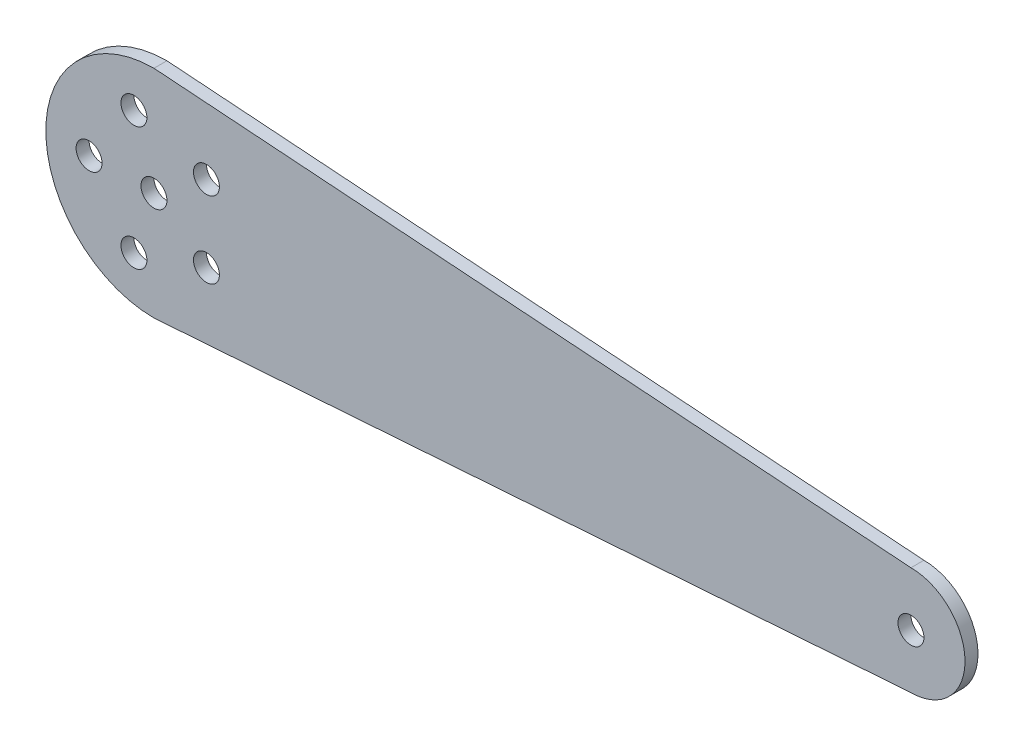
ISO-10303-21;
HEADER;
FILE_DESCRIPTION(('STEP AP214'),'2;1');
FILE_NAME('part.step','',(''),(''),'','','');
FILE_SCHEMA(('AUTOMOTIVE_DESIGN { 1 0 10303 214 1 1 1 1 }'));
ENDSEC;
DATA;
#1=APPLICATION_CONTEXT('core data for automotive mechanical design processes');
#2=APPLICATION_PROTOCOL_DEFINITION('international standard','automotive_design',2000,#1);
#3=PRODUCT_CONTEXT('',#1,'mechanical');
#4=PRODUCT('Part','Part','',(#3));
#5=PRODUCT_RELATED_PRODUCT_CATEGORY('part','',(#4));
#6=PRODUCT_DEFINITION_FORMATION('','',#4);
#7=PRODUCT_DEFINITION_CONTEXT('part definition',#1,'design');
#8=PRODUCT_DEFINITION('design','',#6,#7);
#9=PRODUCT_DEFINITION_SHAPE('','',#8);
#10=(LENGTH_UNIT() NAMED_UNIT(*) SI_UNIT(.MILLI.,.METRE.));
#11=(NAMED_UNIT(*) PLANE_ANGLE_UNIT() SI_UNIT($,.RADIAN.));
#12=(NAMED_UNIT(*) SI_UNIT($,.STERADIAN.) SOLID_ANGLE_UNIT());
#13=UNCERTAINTY_MEASURE_WITH_UNIT(LENGTH_MEASURE(1.E-05),#10,'distance_accuracy_value','');
#14=(GEOMETRIC_REPRESENTATION_CONTEXT(3) GLOBAL_UNCERTAINTY_ASSIGNED_CONTEXT((#13)) GLOBAL_UNIT_ASSIGNED_CONTEXT((#10,
#11,#12)) REPRESENTATION_CONTEXT('',''));
#15=CARTESIAN_POINT('',(0.,0.,0.));
#16=DIRECTION('',(0.,0.,1.));
#17=DIRECTION('',(1.,0.,0.));
#18=AXIS2_PLACEMENT_3D('',#15,#16,#17);
#19=CARTESIAN_POINT('',(0.,0.,3.));
#20=DIRECTION('',(0.,0.,1.));
#21=DIRECTION('',(1.,0.,0.));
#22=AXIS2_PLACEMENT_3D('',#19,#20,#21);
#23=PLANE('',#22);
#24=CARTESIAN_POINT('',(12.1352549156241,-8.8167787843872,3.));
#25=DIRECTION('',(0.,0.,1.));
#26=DIRECTION('',(1.,0.,0.));
#27=AXIS2_PLACEMENT_3D('',#24,#25,#26);
#28=CIRCLE('',#27,3.);
#29=CARTESIAN_POINT('',(15.1352549156241,-8.8167787843872,3.));
#30=VERTEX_POINT('',#29);
#31=EDGE_CURVE('E142',#30,#30,#28,.T.);
#32=ORIENTED_EDGE('',*,*,#31,.F.);
#33=EDGE_LOOP('',(#32));
#34=FACE_BOUND('',#33,.T.);
#35=CARTESIAN_POINT('',(-4.63525491562417,14.2658477444273,3.));
#36=DIRECTION('',(0.,0.,1.));
#37=DIRECTION('',(1.,0.,0.));
#38=AXIS2_PLACEMENT_3D('',#35,#36,#37);
#39=CIRCLE('',#38,3.);
#40=CARTESIAN_POINT('',(-1.63525491562418,14.2658477444273,3.));
#41=VERTEX_POINT('',#40);
#42=EDGE_CURVE('E130',#41,#41,#39,.T.);
#43=ORIENTED_EDGE('',*,*,#42,.F.);
#44=EDGE_LOOP('',(#43));
#45=FACE_BOUND('',#44,.T.);
#46=CARTESIAN_POINT('',(175.,0.,3.));
#47=DIRECTION('',(0.,0.,1.));
#48=DIRECTION('',(1.,0.,0.));
#49=AXIS2_PLACEMENT_3D('',#46,#47,#48);
#50=CIRCLE('',#49,2.99999999999999);
#51=CARTESIAN_POINT('',(178.,0.,3.));
#52=VERTEX_POINT('',#51);
#53=EDGE_CURVE('E118',#52,#52,#50,.T.);
#54=ORIENTED_EDGE('',*,*,#53,.F.);
#55=EDGE_LOOP('',(#54));
#56=FACE_BOUND('',#55,.T.);
#57=CARTESIAN_POINT('',(0.,0.,3.));
#58=DIRECTION('',(0.,0.,1.));
#59=DIRECTION('',(1.,0.,0.));
#60=AXIS2_PLACEMENT_3D('',#57,#58,#59);
#61=CIRCLE('',#60,25.);
#62=CARTESIAN_POINT('',(0.,25.,3.));
#63=VERTEX_POINT('',#62);
#64=CARTESIAN_POINT('',(0.,-25.,3.));
#65=VERTEX_POINT('',#64);
#66=EDGE_CURVE('E88',#63,#65,#61,.T.);
#67=ORIENTED_EDGE('',*,*,#66,.T.);
#68=DIRECTION('',(0.997458699830735,0.0712470499879096,0.));
#69=VECTOR('',#68,1.);
#70=CARTESIAN_POINT('',(0.,-25.,3.));
#71=LINE('',#70,#69);
#72=CARTESIAN_POINT('',(175.,-12.5,3.));
#73=VERTEX_POINT('',#72);
#74=EDGE_CURVE('E83',#65,#73,#71,.T.);
#75=ORIENTED_EDGE('',*,*,#74,.T.);
#76=CARTESIAN_POINT('',(175.,0.,3.));
#77=DIRECTION('',(0.,0.,1.));
#78=DIRECTION('',(1.,0.,0.));
#79=AXIS2_PLACEMENT_3D('',#76,#77,#78);
#80=CIRCLE('',#79,12.5);
#81=CARTESIAN_POINT('',(175.,12.5,3.));
#82=VERTEX_POINT('',#81);
#83=EDGE_CURVE('E86',#73,#82,#80,.T.);
#84=ORIENTED_EDGE('',*,*,#83,.T.);
#85=DIRECTION('',(-0.997458699830735,0.0712470499879096,0.));
#86=VECTOR('',#85,1.);
#87=CARTESIAN_POINT('',(0.,25.,3.));
#88=LINE('',#87,#86);
#89=EDGE_CURVE('E53',#82,#63,#88,.T.);
#90=ORIENTED_EDGE('',*,*,#89,.T.);
#91=EDGE_LOOP('',(#67,#75,#84,#90));
#92=FACE_BOUND('',#91,.T.);
#93=CARTESIAN_POINT('',(0.,0.,3.));
#94=DIRECTION('',(0.,0.,1.));
#95=DIRECTION('',(1.,0.,0.));
#96=AXIS2_PLACEMENT_3D('',#93,#94,#95);
#97=CIRCLE('',#96,3.);
#98=CARTESIAN_POINT('',(3.,0.,3.));
#99=VERTEX_POINT('',#98);
#100=EDGE_CURVE('E103',#99,#99,#97,.T.);
#101=ORIENTED_EDGE('',*,*,#100,.F.);
#102=EDGE_LOOP('',(#101));
#103=FACE_BOUND('',#102,.T.);
#104=CARTESIAN_POINT('',(-15.,0.,3.));
#105=DIRECTION('',(0.,0.,1.));
#106=DIRECTION('',(1.,0.,0.));
#107=AXIS2_PLACEMENT_3D('',#104,#105,#106);
#108=CIRCLE('',#107,3.);
#109=CARTESIAN_POINT('',(-12.,0.,3.));
#110=VERTEX_POINT('',#109);
#111=EDGE_CURVE('E124',#110,#110,#108,.T.);
#112=ORIENTED_EDGE('',*,*,#111,.F.);
#113=EDGE_LOOP('',(#112));
#114=FACE_BOUND('',#113,.T.);
#115=CARTESIAN_POINT('',(12.1352549156243,8.81677878438703,3.));
#116=DIRECTION('',(0.,0.,1.));
#117=DIRECTION('',(1.,0.,0.));
#118=AXIS2_PLACEMENT_3D('',#115,#116,#117);
#119=CIRCLE('',#118,3.);
#120=CARTESIAN_POINT('',(15.1352549156243,8.81677878438703,3.));
#121=VERTEX_POINT('',#120);
#122=EDGE_CURVE('E136',#121,#121,#119,.T.);
#123=ORIENTED_EDGE('',*,*,#122,.F.);
#124=EDGE_LOOP('',(#123));
#125=FACE_BOUND('',#124,.T.);
#126=CARTESIAN_POINT('',(-4.63525491562437,-14.2658477444273,3.));
#127=DIRECTION('',(0.,0.,1.));
#128=DIRECTION('',(1.,0.,0.));
#129=AXIS2_PLACEMENT_3D('',#126,#127,#128);
#130=CIRCLE('',#129,3.);
#131=CARTESIAN_POINT('',(-1.63525491562437,-14.2658477444273,3.));
#132=VERTEX_POINT('',#131);
#133=EDGE_CURVE('E148',#132,#132,#130,.T.);
#134=ORIENTED_EDGE('',*,*,#133,.F.);
#135=EDGE_LOOP('',(#134));
#136=FACE_BOUND('',#135,.T.);
#137=ADVANCED_FACE('F36',(#34,#45,#56,#92,#103,#114,#125,#136),#23,.T.);
#138=CARTESIAN_POINT('',(0.,0.,0.));
#139=DIRECTION('',(0.,0.,1.));
#140=DIRECTION('',(1.,0.,0.));
#141=AXIS2_PLACEMENT_3D('',#138,#139,#140);
#142=PLANE('',#141);
#143=CARTESIAN_POINT('',(0.,0.,0.));
#144=DIRECTION('',(0.,0.,1.));
#145=DIRECTION('',(1.,0.,0.));
#146=AXIS2_PLACEMENT_3D('',#143,#144,#145);
#147=CIRCLE('',#146,25.);
#148=CARTESIAN_POINT('',(0.,25.,0.));
#149=VERTEX_POINT('',#148);
#150=CARTESIAN_POINT('',(0.,-25.,0.));
#151=VERTEX_POINT('',#150);
#152=EDGE_CURVE('E100',#149,#151,#147,.T.);
#153=ORIENTED_EDGE('',*,*,#152,.F.);
#154=DIRECTION('',(-0.997458699830735,0.0712470499879096,0.));
#155=VECTOR('',#154,1.);
#156=CARTESIAN_POINT('',(0.,25.,0.));
#157=LINE('',#156,#155);
#158=CARTESIAN_POINT('',(175.,12.5,0.));
#159=VERTEX_POINT('',#158);
#160=EDGE_CURVE('E76',#159,#149,#157,.T.);
#161=ORIENTED_EDGE('',*,*,#160,.F.);
#162=CARTESIAN_POINT('',(175.,0.,0.));
#163=DIRECTION('',(0.,0.,1.));
#164=DIRECTION('',(1.,0.,0.));
#165=AXIS2_PLACEMENT_3D('',#162,#163,#164);
#166=CIRCLE('',#165,12.5);
#167=CARTESIAN_POINT('',(175.,-12.5,0.));
#168=VERTEX_POINT('',#167);
#169=EDGE_CURVE('E70',#168,#159,#166,.T.);
#170=ORIENTED_EDGE('',*,*,#169,.F.);
#171=DIRECTION('',(0.997458699830735,0.0712470499879096,0.));
#172=VECTOR('',#171,1.);
#173=CARTESIAN_POINT('',(0.,-25.,0.));
#174=LINE('',#173,#172);
#175=EDGE_CURVE('E92',#151,#168,#174,.T.);
#176=ORIENTED_EDGE('',*,*,#175,.F.);
#177=EDGE_LOOP('',(#153,#161,#170,#176));
#178=FACE_BOUND('',#177,.T.);
#179=CARTESIAN_POINT('',(0.,0.,0.));
#180=DIRECTION('',(0.,0.,1.));
#181=DIRECTION('',(1.,0.,0.));
#182=AXIS2_PLACEMENT_3D('',#179,#180,#181);
#183=CIRCLE('',#182,3.);
#184=CARTESIAN_POINT('',(3.,0.,0.));
#185=VERTEX_POINT('',#184);
#186=EDGE_CURVE('E115',#185,#185,#183,.T.);
#187=ORIENTED_EDGE('',*,*,#186,.T.);
#188=EDGE_LOOP('',(#187));
#189=FACE_BOUND('',#188,.T.);
#190=CARTESIAN_POINT('',(175.,0.,0.));
#191=DIRECTION('',(0.,0.,1.));
#192=DIRECTION('',(1.,0.,0.));
#193=AXIS2_PLACEMENT_3D('',#190,#191,#192);
#194=CIRCLE('',#193,2.99999999999999);
#195=CARTESIAN_POINT('',(178.,0.,0.));
#196=VERTEX_POINT('',#195);
#197=EDGE_CURVE('E121',#196,#196,#194,.T.);
#198=ORIENTED_EDGE('',*,*,#197,.T.);
#199=EDGE_LOOP('',(#198));
#200=FACE_BOUND('',#199,.T.);
#201=CARTESIAN_POINT('',(-15.,0.,0.));
#202=DIRECTION('',(0.,0.,1.));
#203=DIRECTION('',(1.,0.,0.));
#204=AXIS2_PLACEMENT_3D('',#201,#202,#203);
#205=CIRCLE('',#204,3.);
#206=CARTESIAN_POINT('',(-12.,0.,0.));
#207=VERTEX_POINT('',#206);
#208=EDGE_CURVE('E127',#207,#207,#205,.T.);
#209=ORIENTED_EDGE('',*,*,#208,.T.);
#210=EDGE_LOOP('',(#209));
#211=FACE_BOUND('',#210,.T.);
#212=CARTESIAN_POINT('',(-4.63525491562417,14.2658477444273,0.));
#213=DIRECTION('',(0.,0.,1.));
#214=DIRECTION('',(1.,0.,0.));
#215=AXIS2_PLACEMENT_3D('',#212,#213,#214);
#216=CIRCLE('',#215,3.);
#217=CARTESIAN_POINT('',(-1.63525491562418,14.2658477444273,0.));
#218=VERTEX_POINT('',#217);
#219=EDGE_CURVE('E133',#218,#218,#216,.T.);
#220=ORIENTED_EDGE('',*,*,#219,.T.);
#221=EDGE_LOOP('',(#220));
#222=FACE_BOUND('',#221,.T.);
#223=CARTESIAN_POINT('',(12.1352549156243,8.81677878438703,0.));
#224=DIRECTION('',(0.,0.,1.));
#225=DIRECTION('',(1.,0.,0.));
#226=AXIS2_PLACEMENT_3D('',#223,#224,#225);
#227=CIRCLE('',#226,3.);
#228=CARTESIAN_POINT('',(15.1352549156243,8.81677878438703,0.));
#229=VERTEX_POINT('',#228);
#230=EDGE_CURVE('E139',#229,#229,#227,.T.);
#231=ORIENTED_EDGE('',*,*,#230,.T.);
#232=EDGE_LOOP('',(#231));
#233=FACE_BOUND('',#232,.T.);
#234=CARTESIAN_POINT('',(12.1352549156241,-8.8167787843872,0.));
#235=DIRECTION('',(0.,0.,1.));
#236=DIRECTION('',(1.,0.,0.));
#237=AXIS2_PLACEMENT_3D('',#234,#235,#236);
#238=CIRCLE('',#237,3.);
#239=CARTESIAN_POINT('',(15.1352549156241,-8.8167787843872,0.));
#240=VERTEX_POINT('',#239);
#241=EDGE_CURVE('E145',#240,#240,#238,.T.);
#242=ORIENTED_EDGE('',*,*,#241,.T.);
#243=EDGE_LOOP('',(#242));
#244=FACE_BOUND('',#243,.T.);
#245=CARTESIAN_POINT('',(-4.63525491562437,-14.2658477444273,0.));
#246=DIRECTION('',(0.,0.,1.));
#247=DIRECTION('',(1.,0.,0.));
#248=AXIS2_PLACEMENT_3D('',#245,#246,#247);
#249=CIRCLE('',#248,3.);
#250=CARTESIAN_POINT('',(-1.63525491562437,-14.2658477444273,0.));
#251=VERTEX_POINT('',#250);
#252=EDGE_CURVE('E151',#251,#251,#249,.T.);
#253=ORIENTED_EDGE('',*,*,#252,.T.);
#254=EDGE_LOOP('',(#253));
#255=FACE_BOUND('',#254,.T.);
#256=ADVANCED_FACE('F111',(#178,#189,#200,#211,#222,#233,#244,#255),#142,.F.);
#257=CARTESIAN_POINT('',(0.,0.,3.));
#258=DIRECTION('',(0.,0.,-1.));
#259=DIRECTION('',(-1.,0.,0.));
#260=AXIS2_PLACEMENT_3D('',#257,#258,#259);
#261=CYLINDRICAL_SURFACE('',#260,25.);
#262=ORIENTED_EDGE('',*,*,#152,.T.);
#263=DIRECTION('',(0.,0.,-1.));
#264=VECTOR('',#263,1.);
#265=CARTESIAN_POINT('',(0.,-25.,3.));
#266=LINE('',#265,#264);
#267=EDGE_CURVE('E11',#65,#151,#266,.T.);
#268=ORIENTED_EDGE('',*,*,#267,.F.);
#269=ORIENTED_EDGE('',*,*,#66,.F.);
#270=DIRECTION('',(0.,0.,-1.));
#271=VECTOR('',#270,1.);
#272=CARTESIAN_POINT('',(0.,25.,3.));
#273=LINE('',#272,#271);
#274=EDGE_CURVE('E96',#63,#149,#273,.T.);
#275=ORIENTED_EDGE('',*,*,#274,.T.);
#276=EDGE_LOOP('',(#262,#268,#269,#275));
#277=FACE_BOUND('',#276,.T.);
#278=ADVANCED_FACE('F38',(#277),#261,.T.);
#279=CARTESIAN_POINT('',(0.,-25.,3.));
#280=DIRECTION('',(-0.0712470499879096,0.997458699830735,0.));
#281=DIRECTION('',(-0.997458699830735,-0.0712470499879096,0.));
#282=AXIS2_PLACEMENT_3D('',#279,#280,#281);
#283=PLANE('',#282);
#284=ORIENTED_EDGE('',*,*,#175,.T.);
#285=DIRECTION('',(0.,0.,-1.));
#286=VECTOR('',#285,1.);
#287=CARTESIAN_POINT('',(175.,-12.5,3.));
#288=LINE('',#287,#286);
#289=EDGE_CURVE('E45',#73,#168,#288,.T.);
#290=ORIENTED_EDGE('',*,*,#289,.F.);
#291=ORIENTED_EDGE('',*,*,#74,.F.);
#292=ORIENTED_EDGE('',*,*,#267,.T.);
#293=EDGE_LOOP('',(#284,#290,#291,#292));
#294=FACE_BOUND('',#293,.T.);
#295=ADVANCED_FACE('F91',(#294),#283,.F.);
#296=CARTESIAN_POINT('',(175.,0.,3.));
#297=DIRECTION('',(0.,0.,-1.));
#298=DIRECTION('',(-1.,0.,0.));
#299=AXIS2_PLACEMENT_3D('',#296,#297,#298);
#300=CYLINDRICAL_SURFACE('',#299,12.5);
#301=ORIENTED_EDGE('',*,*,#169,.T.);
#302=DIRECTION('',(0.,0.,-1.));
#303=VECTOR('',#302,1.);
#304=CARTESIAN_POINT('',(175.,12.5,3.));
#305=LINE('',#304,#303);
#306=EDGE_CURVE('E93',#82,#159,#305,.T.);
#307=ORIENTED_EDGE('',*,*,#306,.F.);
#308=ORIENTED_EDGE('',*,*,#83,.F.);
#309=ORIENTED_EDGE('',*,*,#289,.T.);
#310=EDGE_LOOP('',(#301,#307,#308,#309));
#311=FACE_BOUND('',#310,.T.);
#312=ADVANCED_FACE('F94',(#311),#300,.T.);
#313=CARTESIAN_POINT('',(0.,25.,3.));
#314=DIRECTION('',(-0.0712470499879096,-0.997458699830735,0.));
#315=DIRECTION('',(0.997458699830735,-0.0712470499879096,0.));
#316=AXIS2_PLACEMENT_3D('',#313,#314,#315);
#317=PLANE('',#316);
#318=ORIENTED_EDGE('',*,*,#160,.T.);
#319=ORIENTED_EDGE('',*,*,#274,.F.);
#320=ORIENTED_EDGE('',*,*,#89,.F.);
#321=ORIENTED_EDGE('',*,*,#306,.T.);
#322=EDGE_LOOP('',(#318,#319,#320,#321));
#323=FACE_BOUND('',#322,.T.);
#324=ADVANCED_FACE('F108',(#323),#317,.F.);
#325=CARTESIAN_POINT('',(0.,0.,3.));
#326=DIRECTION('',(0.,0.,-1.));
#327=DIRECTION('',(-1.,0.,0.));
#328=AXIS2_PLACEMENT_3D('',#325,#326,#327);
#329=CYLINDRICAL_SURFACE('',#328,3.);
#330=ORIENTED_EDGE('',*,*,#100,.T.);
#331=EDGE_LOOP('',(#330));
#332=FACE_BOUND('',#331,.T.);
#333=ORIENTED_EDGE('',*,*,#186,.F.);
#334=EDGE_LOOP('',(#333));
#335=FACE_BOUND('',#334,.T.);
#336=ADVANCED_FACE('F170',(#332,#335),#329,.F.);
#337=CARTESIAN_POINT('',(175.,0.,3.));
#338=DIRECTION('',(0.,0.,-1.));
#339=DIRECTION('',(-1.,0.,0.));
#340=AXIS2_PLACEMENT_3D('',#337,#338,#339);
#341=CYLINDRICAL_SURFACE('',#340,2.99999999999999);
#342=ORIENTED_EDGE('',*,*,#53,.T.);
#343=EDGE_LOOP('',(#342));
#344=FACE_BOUND('',#343,.T.);
#345=ORIENTED_EDGE('',*,*,#197,.F.);
#346=EDGE_LOOP('',(#345));
#347=FACE_BOUND('',#346,.T.);
#348=ADVANCED_FACE('F224',(#344,#347),#341,.F.);
#349=CARTESIAN_POINT('',(-15.,0.,3.));
#350=DIRECTION('',(0.,0.,-1.));
#351=DIRECTION('',(-1.,0.,0.));
#352=AXIS2_PLACEMENT_3D('',#349,#350,#351);
#353=CYLINDRICAL_SURFACE('',#352,3.);
#354=ORIENTED_EDGE('',*,*,#111,.T.);
#355=EDGE_LOOP('',(#354));
#356=FACE_BOUND('',#355,.T.);
#357=ORIENTED_EDGE('',*,*,#208,.F.);
#358=EDGE_LOOP('',(#357));
#359=FACE_BOUND('',#358,.T.);
#360=ADVANCED_FACE('F233',(#356,#359),#353,.F.);
#361=CARTESIAN_POINT('',(-4.63525491562417,14.2658477444273,3.));
#362=DIRECTION('',(0.,0.,-1.));
#363=DIRECTION('',(-1.,0.,0.));
#364=AXIS2_PLACEMENT_3D('',#361,#362,#363);
#365=CYLINDRICAL_SURFACE('',#364,3.);
#366=ORIENTED_EDGE('',*,*,#42,.T.);
#367=EDGE_LOOP('',(#366));
#368=FACE_BOUND('',#367,.T.);
#369=ORIENTED_EDGE('',*,*,#219,.F.);
#370=EDGE_LOOP('',(#369));
#371=FACE_BOUND('',#370,.T.);
#372=ADVANCED_FACE('F242',(#368,#371),#365,.F.);
#373=CARTESIAN_POINT('',(12.1352549156243,8.81677878438703,3.));
#374=DIRECTION('',(0.,0.,-1.));
#375=DIRECTION('',(-1.,0.,0.));
#376=AXIS2_PLACEMENT_3D('',#373,#374,#375);
#377=CYLINDRICAL_SURFACE('',#376,3.);
#378=ORIENTED_EDGE('',*,*,#122,.T.);
#379=EDGE_LOOP('',(#378));
#380=FACE_BOUND('',#379,.T.);
#381=ORIENTED_EDGE('',*,*,#230,.F.);
#382=EDGE_LOOP('',(#381));
#383=FACE_BOUND('',#382,.T.);
#384=ADVANCED_FACE('F252',(#380,#383),#377,.F.);
#385=CARTESIAN_POINT('',(12.1352549156241,-8.8167787843872,3.));
#386=DIRECTION('',(0.,0.,-1.));
#387=DIRECTION('',(-1.,0.,0.));
#388=AXIS2_PLACEMENT_3D('',#385,#386,#387);
#389=CYLINDRICAL_SURFACE('',#388,3.);
#390=ORIENTED_EDGE('',*,*,#31,.T.);
#391=EDGE_LOOP('',(#390));
#392=FACE_BOUND('',#391,.T.);
#393=ORIENTED_EDGE('',*,*,#241,.F.);
#394=EDGE_LOOP('',(#393));
#395=FACE_BOUND('',#394,.T.);
#396=ADVANCED_FACE('F262',(#392,#395),#389,.F.);
#397=CARTESIAN_POINT('',(-4.63525491562437,-14.2658477444273,3.));
#398=DIRECTION('',(0.,0.,-1.));
#399=DIRECTION('',(-1.,0.,0.));
#400=AXIS2_PLACEMENT_3D('',#397,#398,#399);
#401=CYLINDRICAL_SURFACE('',#400,3.);
#402=ORIENTED_EDGE('',*,*,#133,.T.);
#403=EDGE_LOOP('',(#402));
#404=FACE_BOUND('',#403,.T.);
#405=ORIENTED_EDGE('',*,*,#252,.F.);
#406=EDGE_LOOP('',(#405));
#407=FACE_BOUND('',#406,.T.);
#408=ADVANCED_FACE('F157',(#404,#407),#401,.F.);
#409=CLOSED_SHELL('',(#137,#256,#278,#295,#312,#324,#336,#348,#360,#372,#384,#396,#408));
#410=MANIFOLD_SOLID_BREP('B2',#409);
#411=ADVANCED_BREP_SHAPE_REPRESENTATION('',(#18,#410),#14);
#412=SHAPE_DEFINITION_REPRESENTATION(#9,#411);
ENDSEC;
END-ISO-10303-21;
